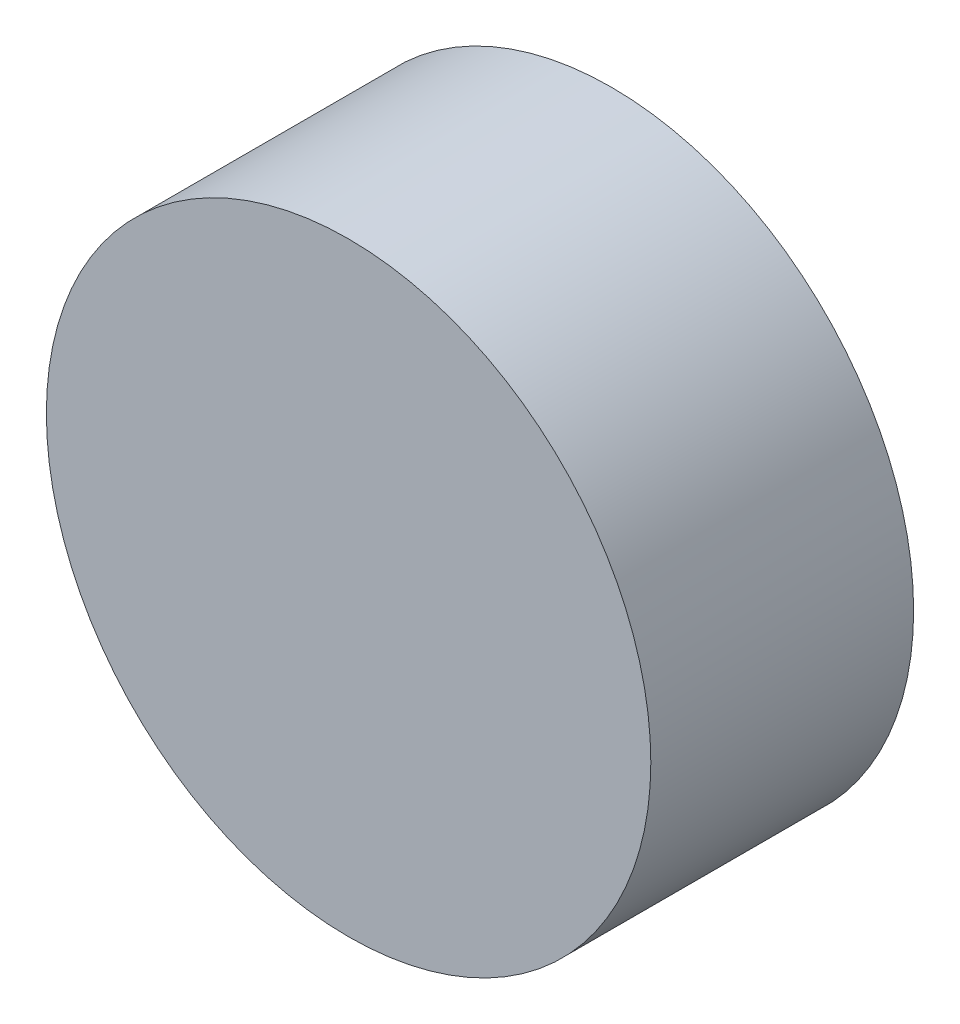
ISO-10303-21;
HEADER;
FILE_DESCRIPTION(('STEP AP214'),'2;1');
FILE_NAME('part.step','',(''),(''),'','','');
FILE_SCHEMA(('AUTOMOTIVE_DESIGN { 1 0 10303 214 1 1 1 1 }'));
ENDSEC;
DATA;
#1=APPLICATION_CONTEXT('core data for automotive mechanical design processes');
#2=APPLICATION_PROTOCOL_DEFINITION('international standard','automotive_design',2000,#1);
#3=PRODUCT_CONTEXT('',#1,'mechanical');
#4=PRODUCT('Part','Part','',(#3));
#5=PRODUCT_RELATED_PRODUCT_CATEGORY('part','',(#4));
#6=PRODUCT_DEFINITION_FORMATION('','',#4);
#7=PRODUCT_DEFINITION_CONTEXT('part definition',#1,'design');
#8=PRODUCT_DEFINITION('design','',#6,#7);
#9=PRODUCT_DEFINITION_SHAPE('','',#8);
#10=(LENGTH_UNIT() NAMED_UNIT(*) SI_UNIT(.MILLI.,.METRE.));
#11=(NAMED_UNIT(*) PLANE_ANGLE_UNIT() SI_UNIT($,.RADIAN.));
#12=(NAMED_UNIT(*) SI_UNIT($,.STERADIAN.) SOLID_ANGLE_UNIT());
#13=UNCERTAINTY_MEASURE_WITH_UNIT(LENGTH_MEASURE(1.E-05),#10,'distance_accuracy_value','');
#14=(GEOMETRIC_REPRESENTATION_CONTEXT(3) GLOBAL_UNCERTAINTY_ASSIGNED_CONTEXT((#13)) GLOBAL_UNIT_ASSIGNED_CONTEXT((#10,
#11,#12)) REPRESENTATION_CONTEXT('',''));
#15=CARTESIAN_POINT('',(0.,0.,0.));
#16=DIRECTION('',(0.,0.,1.));
#17=DIRECTION('',(1.,0.,0.));
#18=AXIS2_PLACEMENT_3D('',#15,#16,#17);
#19=CARTESIAN_POINT('',(27.6641887447392,19.341003872684,-0.329122603143399));
#20=DIRECTION('',(0.,0.,1.));
#21=DIRECTION('',(1.,0.,0.));
#22=AXIS2_PLACEMENT_3D('',#19,#20,#21);
#23=PLANE('',#22);
#24=CARTESIAN_POINT('',(27.6641887447392,19.341003872684,-0.329122603143399));
#25=DIRECTION('',(0.,0.,-1.));
#26=DIRECTION('',(-1.,0.,0.));
#27=AXIS2_PLACEMENT_3D('',#24,#25,#26);
#28=CIRCLE('',#27,0.584199999999999);
#29=CARTESIAN_POINT('',(27.0799887447392,19.341003872684,-0.3291226031434));
#30=VERTEX_POINT('',#29);
#31=EDGE_CURVE('E18',#30,#30,#28,.T.);
#32=ORIENTED_EDGE('',*,*,#31,.F.);
#33=EDGE_LOOP('',(#32));
#34=FACE_BOUND('',#33,.T.);
#35=ADVANCED_FACE('F15',(#34),#23,.T.);
#36=CARTESIAN_POINT('',(27.6641887447392,19.341003872684,-0.329122603143399));
#37=DIRECTION('',(0.,0.,-1.));
#38=DIRECTION('',(-1.,0.,0.));
#39=AXIS2_PLACEMENT_3D('',#36,#37,#38);
#40=CYLINDRICAL_SURFACE('',#39,0.584199999999999);
#41=ORIENTED_EDGE('',*,*,#31,.T.);
#42=EDGE_LOOP('',(#41));
#43=FACE_BOUND('',#42,.T.);
#44=CARTESIAN_POINT('',(27.6641887447392,19.341003872684,-0.837122603143399));
#45=DIRECTION('',(0.,0.,-1.));
#46=DIRECTION('',(-1.,0.,0.));
#47=AXIS2_PLACEMENT_3D('',#44,#45,#46);
#48=CIRCLE('',#47,0.584199999999999);
#49=CARTESIAN_POINT('',(27.0799887447392,19.341003872684,-0.8371226031434));
#50=VERTEX_POINT('',#49);
#51=EDGE_CURVE('E10',#50,#50,#48,.F.);
#52=ORIENTED_EDGE('',*,*,#51,.T.);
#53=EDGE_LOOP('',(#52));
#54=FACE_BOUND('',#53,.T.);
#55=ADVANCED_FACE('F27',(#43,#54),#40,.T.);
#56=CARTESIAN_POINT('',(27.6641887447392,19.341003872684,-0.837122603143399));
#57=DIRECTION('',(0.,0.,1.));
#58=DIRECTION('',(1.,0.,0.));
#59=AXIS2_PLACEMENT_3D('',#56,#57,#58);
#60=PLANE('',#59);
#61=ORIENTED_EDGE('',*,*,#51,.F.);
#62=EDGE_LOOP('',(#61));
#63=FACE_BOUND('',#62,.T.);
#64=ADVANCED_FACE('F34',(#63),#60,.F.);
#65=CLOSED_SHELL('',(#35,#55,#64));
#66=MANIFOLD_SOLID_BREP('B1',#65);
#67=ADVANCED_BREP_SHAPE_REPRESENTATION('',(#18,#66),#14);
#68=SHAPE_DEFINITION_REPRESENTATION(#9,#67);
ENDSEC;
END-ISO-10303-21;
